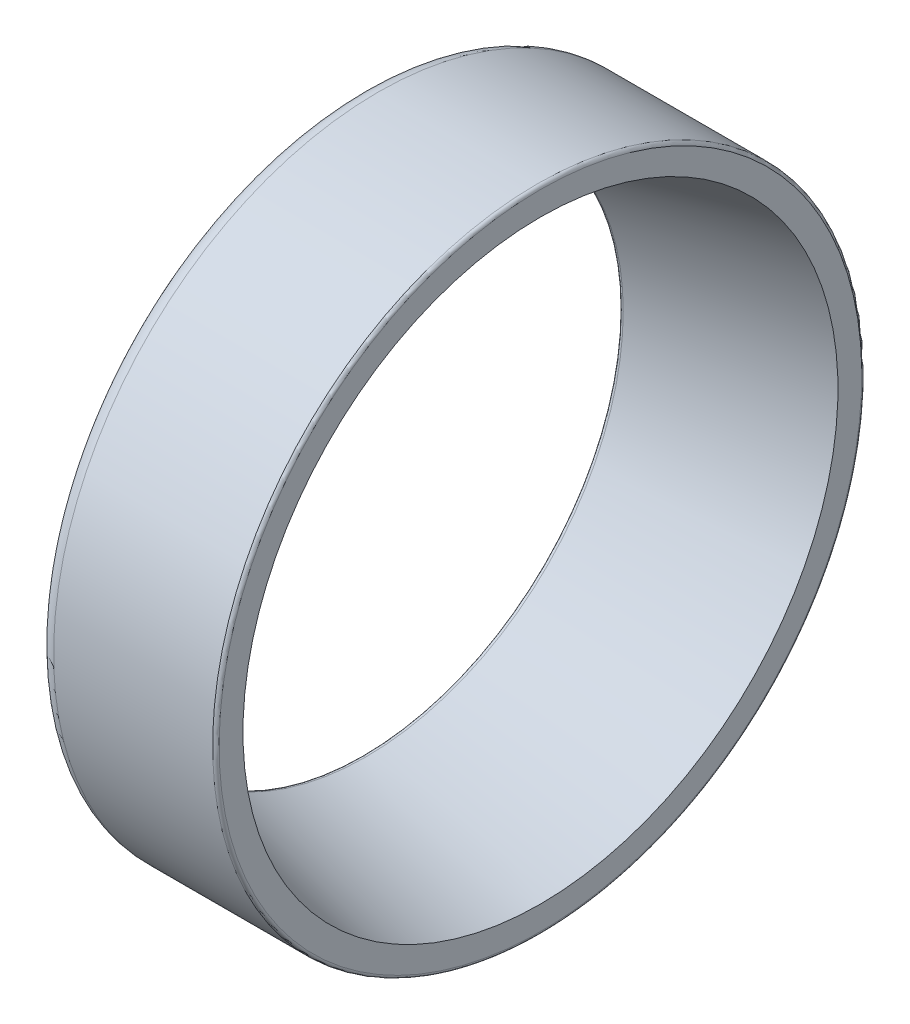
ISO-10303-21;
HEADER;
FILE_DESCRIPTION(('STEP AP214'),'2;1');
FILE_NAME('part.step','',(''),(''),'','','');
FILE_SCHEMA(('AUTOMOTIVE_DESIGN { 1 0 10303 214 1 1 1 1 }'));
ENDSEC;
DATA;
#1=APPLICATION_CONTEXT('core data for automotive mechanical design processes');
#2=APPLICATION_PROTOCOL_DEFINITION('international standard','automotive_design',2000,#1);
#3=PRODUCT_CONTEXT('',#1,'mechanical');
#4=PRODUCT('Part','Part','',(#3));
#5=PRODUCT_RELATED_PRODUCT_CATEGORY('part','',(#4));
#6=PRODUCT_DEFINITION_FORMATION('','',#4);
#7=PRODUCT_DEFINITION_CONTEXT('part definition',#1,'design');
#8=PRODUCT_DEFINITION('design','',#6,#7);
#9=PRODUCT_DEFINITION_SHAPE('','',#8);
#10=(LENGTH_UNIT() NAMED_UNIT(*) SI_UNIT(.MILLI.,.METRE.));
#11=(NAMED_UNIT(*) PLANE_ANGLE_UNIT() SI_UNIT($,.RADIAN.));
#12=(NAMED_UNIT(*) SI_UNIT($,.STERADIAN.) SOLID_ANGLE_UNIT());
#13=UNCERTAINTY_MEASURE_WITH_UNIT(LENGTH_MEASURE(1.E-05),#10,'distance_accuracy_value','');
#14=(GEOMETRIC_REPRESENTATION_CONTEXT(3) GLOBAL_UNCERTAINTY_ASSIGNED_CONTEXT((#13)) GLOBAL_UNIT_ASSIGNED_CONTEXT((#10,
#11,#12)) REPRESENTATION_CONTEXT('',''));
#15=CARTESIAN_POINT('',(0.,0.,0.));
#16=DIRECTION('',(0.,0.,1.));
#17=DIRECTION('',(1.,0.,0.));
#18=AXIS2_PLACEMENT_3D('',#15,#16,#17);
#19=CARTESIAN_POINT('',(0.2,0.,0.));
#20=DIRECTION('',(1.,0.,0.));
#21=DIRECTION('',(0.,0.,-1.));
#22=AXIS2_PLACEMENT_3D('',#19,#20,#21);
#23=TOROIDAL_SURFACE('',#22,16.0516378603814,0.2);
#24=CARTESIAN_POINT('',(0.244830339671573,0.,0.));
#25=DIRECTION('',(1.,0.,0.));
#26=DIRECTION('',(0.,1.,0.));
#27=AXIS2_PLACEMENT_3D('',#24,#25,#26);
#28=CIRCLE('',#27,15.8567270073103);
#29=CARTESIAN_POINT('',(0.244830339671573,15.8567270073103,0.));
#30=VERTEX_POINT('',#29);
#31=EDGE_CURVE('E11',#30,#30,#28,.T.);
#32=ORIENTED_EDGE('',*,*,#31,.T.);
#33=EDGE_LOOP('',(#32));
#34=FACE_BOUND('',#33,.T.);
#35=CARTESIAN_POINT('',(0.,0.,0.));
#36=DIRECTION('',(1.,0.,0.));
#37=DIRECTION('',(0.,1.,0.));
#38=AXIS2_PLACEMENT_3D('',#35,#36,#37);
#39=CIRCLE('',#38,16.0516378603814);
#40=CARTESIAN_POINT('',(0.,16.0516378603814,0.));
#41=VERTEX_POINT('',#40);
#42=EDGE_CURVE('E54',#41,#41,#39,.T.);
#43=ORIENTED_EDGE('',*,*,#42,.F.);
#44=EDGE_LOOP('',(#43));
#45=FACE_BOUND('',#44,.T.);
#46=ADVANCED_FACE('F16',(#34,#45),#23,.T.);
#47=CARTESIAN_POINT('',(5.62241516983579,0.,0.));
#48=DIRECTION('',(1.,0.,0.));
#49=DIRECTION('',(0.,1.,0.));
#50=AXIS2_PLACEMENT_3D('',#47,#48,#49);
#51=CONICAL_SURFACE('',#50,17.0935947894287,0.226072498010826);
#52=CARTESIAN_POINT('',(11.,0.,0.));
#53=DIRECTION('',(1.,0.,0.));
#54=DIRECTION('',(0.,1.,0.));
#55=AXIS2_PLACEMENT_3D('',#52,#53,#54);
#56=CIRCLE('',#55,18.3304625715472);
#57=CARTESIAN_POINT('',(11.,18.3304625715472,0.));
#58=VERTEX_POINT('',#57);
#59=EDGE_CURVE('E23',#58,#58,#56,.T.);
#60=ORIENTED_EDGE('',*,*,#59,.T.);
#61=EDGE_LOOP('',(#60));
#62=FACE_BOUND('',#61,.T.);
#63=ORIENTED_EDGE('',*,*,#31,.F.);
#64=EDGE_LOOP('',(#63));
#65=FACE_BOUND('',#64,.T.);
#66=ADVANCED_FACE('F77',(#62,#65),#51,.F.);
#67=CARTESIAN_POINT('',(11.,19.0652312857736,0.));
#68=DIRECTION('',(1.,0.,0.));
#69=DIRECTION('',(0.,1.,0.));
#70=AXIS2_PLACEMENT_3D('',#67,#68,#69);
#71=PLANE('',#70);
#72=CARTESIAN_POINT('',(11.,0.,0.));
#73=DIRECTION('',(1.,0.,0.));
#74=DIRECTION('',(0.,1.,0.));
#75=AXIS2_PLACEMENT_3D('',#72,#73,#74);
#76=CIRCLE('',#75,19.8);
#77=CARTESIAN_POINT('',(11.,19.8,0.));
#78=VERTEX_POINT('',#77);
#79=EDGE_CURVE('E51',#78,#78,#76,.T.);
#80=ORIENTED_EDGE('',*,*,#79,.T.);
#81=EDGE_LOOP('',(#80));
#82=FACE_BOUND('',#81,.T.);
#83=ORIENTED_EDGE('',*,*,#59,.F.);
#84=EDGE_LOOP('',(#83));
#85=FACE_BOUND('',#84,.T.);
#86=ADVANCED_FACE('F81',(#82,#85),#71,.T.);
#87=CARTESIAN_POINT('',(10.8,0.,0.));
#88=DIRECTION('',(1.,0.,0.));
#89=DIRECTION('',(0.,0.,-1.));
#90=AXIS2_PLACEMENT_3D('',#87,#88,#89);
#91=TOROIDAL_SURFACE('',#90,19.8,0.2);
#92=CARTESIAN_POINT('',(10.8,0.,0.));
#93=DIRECTION('',(1.,0.,0.));
#94=DIRECTION('',(0.,1.,0.));
#95=AXIS2_PLACEMENT_3D('',#92,#93,#94);
#96=CIRCLE('',#95,20.);
#97=CARTESIAN_POINT('',(10.8,20.,0.));
#98=VERTEX_POINT('',#97);
#99=EDGE_CURVE('E47',#98,#98,#96,.T.);
#100=ORIENTED_EDGE('',*,*,#99,.T.);
#101=EDGE_LOOP('',(#100));
#102=FACE_BOUND('',#101,.T.);
#103=ORIENTED_EDGE('',*,*,#79,.F.);
#104=EDGE_LOOP('',(#103));
#105=FACE_BOUND('',#104,.T.);
#106=ADVANCED_FACE('F48',(#102,#105),#91,.T.);
#107=CARTESIAN_POINT('',(5.9,0.,0.));
#108=DIRECTION('',(-1.,0.,0.));
#109=DIRECTION('',(0.,1.,0.));
#110=AXIS2_PLACEMENT_3D('',#107,#108,#109);
#111=CYLINDRICAL_SURFACE('',#110,20.);
#112=CARTESIAN_POINT('',(1.,0.,0.));
#113=DIRECTION('',(1.,0.,0.));
#114=DIRECTION('',(0.,1.,0.));
#115=AXIS2_PLACEMENT_3D('',#112,#113,#114);
#116=CIRCLE('',#115,20.);
#117=CARTESIAN_POINT('',(1.,20.,0.));
#118=VERTEX_POINT('',#117);
#119=EDGE_CURVE('E52',#118,#118,#116,.T.);
#120=ORIENTED_EDGE('',*,*,#119,.T.);
#121=EDGE_LOOP('',(#120));
#122=FACE_BOUND('',#121,.T.);
#123=ORIENTED_EDGE('',*,*,#99,.F.);
#124=EDGE_LOOP('',(#123));
#125=FACE_BOUND('',#124,.T.);
#126=ADVANCED_FACE('F73',(#122,#125),#111,.T.);
#127=CARTESIAN_POINT('',(1.,0.,0.));
#128=DIRECTION('',(1.,0.,0.));
#129=DIRECTION('',(0.,0.,-1.));
#130=AXIS2_PLACEMENT_3D('',#127,#128,#129);
#131=TOROIDAL_SURFACE('',#130,19.,1.);
#132=CARTESIAN_POINT('',(0.,0.,0.));
#133=DIRECTION('',(1.,0.,0.));
#134=DIRECTION('',(0.,1.,0.));
#135=AXIS2_PLACEMENT_3D('',#132,#133,#134);
#136=CIRCLE('',#135,19.);
#137=CARTESIAN_POINT('',(0.,19.,0.));
#138=VERTEX_POINT('',#137);
#139=EDGE_CURVE('E58',#138,#138,#136,.T.);
#140=ORIENTED_EDGE('',*,*,#139,.T.);
#141=EDGE_LOOP('',(#140));
#142=FACE_BOUND('',#141,.T.);
#143=ORIENTED_EDGE('',*,*,#119,.F.);
#144=EDGE_LOOP('',(#143));
#145=FACE_BOUND('',#144,.T.);
#146=ADVANCED_FACE('F62',(#142,#145),#131,.T.);
#147=CARTESIAN_POINT('',(0.,17.5258189301907,0.));
#148=DIRECTION('',(-1.,0.,0.));
#149=DIRECTION('',(0.,-1.,0.));
#150=AXIS2_PLACEMENT_3D('',#147,#148,#149);
#151=PLANE('',#150);
#152=ORIENTED_EDGE('',*,*,#42,.T.);
#153=EDGE_LOOP('',(#152));
#154=FACE_BOUND('',#153,.T.);
#155=ORIENTED_EDGE('',*,*,#139,.F.);
#156=EDGE_LOOP('',(#155));
#157=FACE_BOUND('',#156,.T.);
#158=ADVANCED_FACE('F65',(#154,#157),#151,.T.);
#159=CLOSED_SHELL('',(#46,#66,#86,#106,#126,#146,#158));
#160=MANIFOLD_SOLID_BREP('B1',#159);
#161=ADVANCED_BREP_SHAPE_REPRESENTATION('',(#18,#160),#14);
#162=SHAPE_DEFINITION_REPRESENTATION(#9,#161);
ENDSEC;
END-ISO-10303-21;
